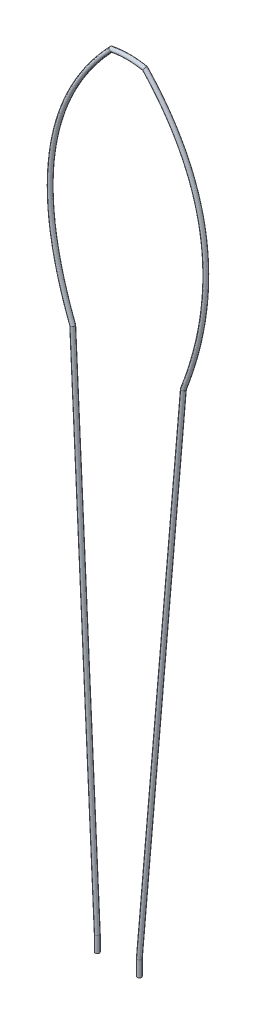
ISO-10303-21;
HEADER;
FILE_DESCRIPTION(('STEP AP214'),'2;1');
FILE_NAME('part.step','',(''),(''),'','','');
FILE_SCHEMA(('AUTOMOTIVE_DESIGN { 1 0 10303 214 1 1 1 1 }'));
ENDSEC;
DATA;
#1=APPLICATION_CONTEXT('core data for automotive mechanical design processes');
#2=APPLICATION_PROTOCOL_DEFINITION('international standard','automotive_design',2000,#1);
#3=PRODUCT_CONTEXT('',#1,'mechanical');
#4=PRODUCT('Part','Part','',(#3));
#5=PRODUCT_RELATED_PRODUCT_CATEGORY('part','',(#4));
#6=PRODUCT_DEFINITION_FORMATION('','',#4);
#7=PRODUCT_DEFINITION_CONTEXT('part definition',#1,'design');
#8=PRODUCT_DEFINITION('design','',#6,#7);
#9=PRODUCT_DEFINITION_SHAPE('','',#8);
#10=(LENGTH_UNIT() NAMED_UNIT(*) SI_UNIT(.MILLI.,.METRE.));
#11=(NAMED_UNIT(*) PLANE_ANGLE_UNIT() SI_UNIT($,.RADIAN.));
#12=(NAMED_UNIT(*) SI_UNIT($,.STERADIAN.) SOLID_ANGLE_UNIT());
#13=UNCERTAINTY_MEASURE_WITH_UNIT(LENGTH_MEASURE(1.E-05),#10,'distance_accuracy_value','');
#14=(GEOMETRIC_REPRESENTATION_CONTEXT(3) GLOBAL_UNCERTAINTY_ASSIGNED_CONTEXT((#13)) GLOBAL_UNIT_ASSIGNED_CONTEXT((#10,
#11,#12)) REPRESENTATION_CONTEXT('',''));
#15=CARTESIAN_POINT('',(0.,0.,0.));
#16=DIRECTION('',(0.,0.,1.));
#17=DIRECTION('',(1.,0.,0.));
#18=AXIS2_PLACEMENT_3D('',#15,#16,#17);
#19=CARTESIAN_POINT('',(98.4304091748136,-88.8841982504118,0.));
#20=DIRECTION('',(0.,1.,0.));
#21=DIRECTION('',(0.,0.,1.));
#22=AXIS2_PLACEMENT_3D('',#19,#20,#21);
#23=PLANE('',#22);
#24=CARTESIAN_POINT('',(98.4304091748136,-88.8841982504118,0.));
#25=DIRECTION('',(0.,1.,0.));
#26=DIRECTION('',(0.,0.,1.));
#27=AXIS2_PLACEMENT_3D('',#24,#25,#26);
#28=CIRCLE('',#27,0.25);
#29=CARTESIAN_POINT('',(98.4304091748136,-88.8841982504118,0.25));
#30=VERTEX_POINT('',#29);
#31=EDGE_CURVE('E48',#30,#30,#28,.T.);
#32=ORIENTED_EDGE('',*,*,#31,.F.);
#33=EDGE_LOOP('',(#32));
#34=FACE_BOUND('',#33,.T.);
#35=ADVANCED_FACE('F45',(#34),#23,.F.);
#36=CARTESIAN_POINT('',(93.4304091748136,-88.8841982504118,0.));
#37=DIRECTION('',(0.,-1.,0.));
#38=DIRECTION('',(0.,0.,1.));
#39=AXIS2_PLACEMENT_3D('',#36,#37,#38);
#40=PLANE('',#39);
#41=CARTESIAN_POINT('',(93.4304091748136,-88.8841982504118,0.));
#42=DIRECTION('',(0.,-1.,0.));
#43=DIRECTION('',(0.,0.,1.));
#44=AXIS2_PLACEMENT_3D('',#41,#42,#43);
#45=CIRCLE('',#44,0.25);
#46=CARTESIAN_POINT('',(93.4304091748136,-88.8841982504118,0.25));
#47=VERTEX_POINT('',#46);
#48=EDGE_CURVE('E54',#47,#47,#45,.T.);
#49=ORIENTED_EDGE('',*,*,#48,.T.);
#50=EDGE_LOOP('',(#49));
#51=FACE_BOUND('',#50,.T.);
#52=ADVANCED_FACE('F208',(#51),#40,.T.);
#53=CARTESIAN_POINT('',(98.4304091748136,-86.8251914155239,0.));
#54=DIRECTION('',(0.,-1.,0.));
#55=DIRECTION('',(0.,0.,-1.));
#56=AXIS2_PLACEMENT_3D('',#53,#54,#55);
#57=CYLINDRICAL_SURFACE('',#56,0.25);
#58=CARTESIAN_POINT('',(98.4304091748136,-87.0251914155239,0.));
#59=DIRECTION('',(-0.0426283769381555,-0.999090997597125,0.));
#60=DIRECTION('',(-0.999090997597125,0.0426283769381555,0.));
#61=AXIS2_PLACEMENT_3D('',#58,#59,#60);
#62=ELLIPSE('',#61,0.250227457360006,0.25);
#63=CARTESIAN_POINT('',(98.1804091748136,-87.0145246251513,0.));
#64=VERTEX_POINT('',#63);
#65=EDGE_CURVE('E92',#64,#64,#62,.T.);
#66=ORIENTED_EDGE('',*,*,#65,.T.);
#67=EDGE_LOOP('',(#66));
#68=FACE_BOUND('',#67,.T.);
#69=ORIENTED_EDGE('',*,*,#31,.T.);
#70=EDGE_LOOP('',(#69));
#71=FACE_BOUND('',#70,.T.);
#72=ADVANCED_FACE('F252',(#68,#71),#57,.T.);
#73=CARTESIAN_POINT('',(103.67756776521,-25.6477054852913,0.));
#74=DIRECTION('',(-0.0851792552821761,-0.996365642959237,0.));
#75=DIRECTION('',(0.996365642959237,-0.0851792552821761,0.));
#76=AXIS2_PLACEMENT_3D('',#73,#74,#75);
#77=CYLINDRICAL_SURFACE('',#76,0.25);
#78=CARTESIAN_POINT('',(103.660531914154,-25.8469786138831,0.25));
#79=CARTESIAN_POINT('',(103.662480363556,-25.8474267718731,0.250000123586937));
#80=CARTESIAN_POINT('',(103.664429321976,-25.8478750382362,0.249976583606907));
#81=CARTESIAN_POINT('',(103.680278610003,-25.851520352543,0.249593129721214));
#82=CARTESIAN_POINT('',(103.694173607914,-25.8547157440667,0.248055677651921));
#83=CARTESIAN_POINT('',(103.721540521826,-25.8610083941347,0.242610381009296));
#84=CARTESIAN_POINT('',(103.735011270705,-25.8641053821461,0.23869651192906));
#85=CARTESIAN_POINT('',(103.761099589944,-25.8701024570513,0.228607630079545));
#86=CARTESIAN_POINT('',(103.773718623095,-25.873002881573,0.222436617305926));
#87=CARTESIAN_POINT('',(103.79777909136,-25.8785324375997,0.207989104864477));
#88=CARTESIAN_POINT('',(103.809218822299,-25.8811611765138,0.199709616597292));
#89=CARTESIAN_POINT('',(103.830497291402,-25.8860502799559,0.181336772697421));
#90=CARTESIAN_POINT('',(103.840345593013,-25.888312845084,0.171255082555696));
#91=CARTESIAN_POINT('',(103.858247551056,-25.8924253410986,0.149509674363791));
#92=CARTESIAN_POINT('',(103.866298756181,-25.8942747083715,0.137843829913053));
#93=CARTESIAN_POINT('',(103.880268149256,-25.8974832955838,0.113408559110432));
#94=CARTESIAN_POINT('',(103.886208661594,-25.8988476455446,0.100652569374198));
#95=CARTESIAN_POINT('',(103.895906567582,-25.9010748678043,0.0742752330349935));
#96=CARTESIAN_POINT('',(103.899661011278,-25.9019370624784,0.060652744502096));
#97=CARTESIAN_POINT('',(103.90483058059,-25.9031242192557,0.0330854901804843));
#98=CARTESIAN_POINT('',(103.906268558602,-25.903454429494,0.0191452660624145));
#99=CARTESIAN_POINT('',(103.906843927449,-25.9035865536514,-0.00879032355101798));
#100=CARTESIAN_POINT('',(103.90597817049,-25.9033877447254,-0.022785738376211));
#101=CARTESIAN_POINT('',(103.89993524307,-25.9020000523981,-0.0641007248306422));
#102=CARTESIAN_POINT('',(103.891353940902,-25.9000294393461,-0.0909802576589777));
#103=CARTESIAN_POINT('',(103.866025512096,-25.8942120217755,-0.140341877686288));
#104=CARTESIAN_POINT('',(103.849257037696,-25.8903603123576,-0.162812252243708));
#105=CARTESIAN_POINT('',(103.809152936895,-25.8811462570447,-0.201247299064957));
#106=CARTESIAN_POINT('',(103.78570575623,-25.875758248665,-0.217089084722126));
#107=CARTESIAN_POINT('',(103.734953143866,-25.8640923659907,-0.239945646150534));
#108=CARTESIAN_POINT('',(103.707648453836,-25.8578146627537,-0.246962116171133));
#109=CARTESIAN_POINT('',(103.675569702729,-25.8504372643947,-0.249577697139247));
#110=CARTESIAN_POINT('',(103.670975808722,-25.8493807218337,-0.249818795968514));
#111=CARTESIAN_POINT('',(103.664430055989,-25.8478752069333,-0.249976313097081));
#112=CARTESIAN_POINT('',(103.662481266806,-25.8474269793814,-0.249999769623248));
#113=CARTESIAN_POINT('',(103.660531914154,-25.846978613883,-0.25));
#114=B_SPLINE_CURVE_WITH_KNOTS('',3,(#78,#79,#80,#81,#82,#83,#84,#85,#86,#87,#88,#89,#90,#91,
#92,#93,#94,#95,#96,#97,#98,#99,#100,#101,#102,#103,#104,#105,#106,#107,#108,#109,#110,#111,
#112,#113),.UNSPECIFIED.,.F.,.F.,(4,2,2,2,2,2,2,2,2,2,2,2,2,2,2,2,2,4),(0.,0.00599931926925032,
0.0487902429804174,0.0916901024856514,0.134514302489898,0.177399543624487,0.220016631168717,
0.26269149948709,0.30490053445358,0.347166396485674,0.38901268589639,0.430916182898124,
0.514052322266972,0.597406403293345,0.682243794380924,0.767064896233011,0.781223529930374,
0.787222849200372),.UNSPECIFIED.);
#115=CARTESIAN_POINT('',(103.660531914154,-25.846978613883,-0.25));
#116=VERTEX_POINT('',#115);
#117=CARTESIAN_POINT('',(103.660531914154,-25.8469786138831,0.25));
#118=VERTEX_POINT('',#117);
#119=EDGE_CURVE('E82',#116,#118,#114,.F.);
#120=ORIENTED_EDGE('',*,*,#119,.T.);
#121=CARTESIAN_POINT('',(103.660531914154,-25.8469786138831,0.25));
#122=CARTESIAN_POINT('',(103.658583464699,-25.8465304560091,0.250000123584482));
#123=CARTESIAN_POINT('',(103.656634508171,-25.8460821814606,0.249976583605752));
#124=CARTESIAN_POINT('',(103.640784781129,-25.8424366255877,0.249593119043322));
#125=CARTESIAN_POINT('',(103.626889437467,-25.839240590329,0.248055579265373));
#126=CARTESIAN_POINT('',(103.599522035961,-25.8329458747837,0.242610014113936));
#127=CARTESIAN_POINT('',(103.586051145901,-25.829847463086,0.238695963324922));
#128=CARTESIAN_POINT('',(103.559962732486,-25.8238469173933,0.228606675734152));
#129=CARTESIAN_POINT('',(103.547343745013,-25.8209444466458,0.222435441805673));
#130=CARTESIAN_POINT('',(103.523283478863,-25.8154103851236,0.207987455629567));
#131=CARTESIAN_POINT('',(103.511843904679,-25.8127791863926,0.199707714458069));
#132=CARTESIAN_POINT('',(103.490565641547,-25.8078850040681,0.181334176031878));
#133=CARTESIAN_POINT('',(103.480717412536,-25.8056198261918,0.171252015580514));
#134=CARTESIAN_POINT('',(103.46281569569,-25.8015022751279,0.149505551006106));
#135=CARTESIAN_POINT('',(103.454764659121,-25.7996504657512,0.137839120470464));
#136=CARTESIAN_POINT('',(103.440795869758,-25.7964375203343,0.113402853534564));
#137=CARTESIAN_POINT('',(103.434855745276,-25.7950712386169,0.100646482689712));
#138=CARTESIAN_POINT('',(103.425158648974,-25.7928408194917,0.0742683463074073));
#139=CARTESIAN_POINT('',(103.421404626528,-25.7919773604661,0.0606454390260176));
#140=CARTESIAN_POINT('',(103.416236066848,-25.7907885450577,0.0330780118590248));
#141=CARTESIAN_POINT('',(103.414798569443,-25.790457907629,0.0191380548485107));
#142=CARTESIAN_POINT('',(103.414223992187,-25.7903257496519,-0.00879693714279142));
#143=CARTESIAN_POINT('',(103.415090059424,-25.7905249529625,-0.0227920213637436));
#144=CARTESIAN_POINT('',(103.421133525194,-25.791915004767,-0.0641051759567712));
#145=CARTESIAN_POINT('',(103.429714538737,-25.793888715477,-0.0909831140823638));
#146=CARTESIAN_POINT('',(103.455041316685,-25.799714099739,-0.140342176279831));
#147=CARTESIAN_POINT('',(103.471808582624,-25.8035707188286,-0.162811501857238));
#148=CARTESIAN_POINT('',(103.511911137578,-25.8127946514152,-0.201246554996148));
#149=CARTESIAN_POINT('',(103.535358460274,-25.8181877334892,-0.217088866534333));
#150=CARTESIAN_POINT('',(103.58611201909,-25.8298614660552,-0.239946072621147));
#151=CARTESIAN_POINT('',(103.613417514744,-25.8361419462366,-0.24696265846088));
#152=CARTESIAN_POINT('',(103.645496314163,-25.8435203131417,-0.249577810933675));
#153=CARTESIAN_POINT('',(103.650089112453,-25.8445766912857,-0.249818822154134));
#154=CARTESIAN_POINT('',(103.656633774214,-25.8460820125372,-0.249976313116991));
#155=CARTESIAN_POINT('',(103.6585825615,-25.8465302481958,-0.249999769635366));
#156=CARTESIAN_POINT('',(103.660531914154,-25.846978613883,-0.25));
#157=B_SPLINE_CURVE_WITH_KNOTS('',3,(#121,#122,#123,#124,#125,#126,#127,#128,#129,#130,#131,
#132,#133,#134,#135,#136,#137,#138,#139,#140,#141,#142,#143,#144,#145,#146,#147,#148,#149,#150,
#151,#152,#153,#154,#155,#156),.UNSPECIFIED.,.F.,.F.,(4,2,2,2,2,2,2,2,2,2,2,2,2,2,2,2,2,4),(0.,
0.00599931926820248,0.0487916893638889,0.091693011110716,0.134518617930567,0.177405273632655,
0.220024435148263,0.262701376301339,0.304911494074556,0.347178428372996,0.389023799751851,
0.430926368878063,0.514058491339466,0.597410148118723,0.682251543605025,0.767076678290314,
0.781231990937181,0.787231310206237),.UNSPECIFIED.);
#158=EDGE_CURVE('E84',#116,#118,#157,.F.);
#159=ORIENTED_EDGE('',*,*,#158,.F.);
#160=EDGE_LOOP('',(#120,#159));
#161=FACE_BOUND('',#160,.T.);
#162=ORIENTED_EDGE('',*,*,#65,.F.);
#163=EDGE_LOOP('',(#162));
#164=FACE_BOUND('',#163,.T.);
#165=ADVANCED_FACE('F90',(#161,#164),#77,.T.);
#166=CARTESIAN_POINT('',(98.9161816177439,5.05492095703359,0.25));
#167=CARTESIAN_POINT('',(98.9792153162674,4.98767452720953,0.25));
#168=CARTESIAN_POINT('',(99.0422497615282,4.92042833591178,0.25));
#169=CARTESIAN_POINT('',(101.038234359238,2.7910133161343,0.25));
#170=CARTESIAN_POINT('',(102.582889192364,0.60481318059812,0.25));
#171=CARTESIAN_POINT('',(104.895467837564,-4.01569454638179,0.25));
#172=CARTESIAN_POINT('',(105.663414548912,-6.44999482319255,0.25));
#173=CARTESIAN_POINT('',(106.422622749062,-11.566688203374,0.25));
#174=CARTESIAN_POINT('',(106.413884237859,-14.2490813068383,0.25));
#175=CARTESIAN_POINT('',(105.619721992908,-19.8619603403891,0.25));
#176=CARTESIAN_POINT('',(104.83427847987,-22.7924525885129,0.25));
#177=CARTESIAN_POINT('',(103.636619081858,-25.9092087159521,0.25));
#178=CARTESIAN_POINT('',(103.612705443631,-25.9714390754572,0.25));
#179=CARTESIAN_POINT('',(103.588792208371,-26.033669306244,0.25));
#180=CARTESIAN_POINT('',(99.2809768244092,5.3968631410267,0.25));
#181=CARTESIAN_POINT('',(99.3440105229327,5.32961671120264,0.25));
#182=CARTESIAN_POINT('',(99.4065608229139,5.26288703796779,0.25));
#183=CARTESIAN_POINT('',(101.417876235599,3.1171160953157,0.25));
#184=CARTESIAN_POINT('',(103.006751991853,0.875074712842028,0.25));
#185=CARTESIAN_POINT('',(105.365852182536,-3.83838257111502,0.25));
#186=CARTESIAN_POINT('',(106.150388943162,-6.32531587117774,0.25));
#187=CARTESIAN_POINT('',(106.924818734805,-11.5445953619634,0.25));
#188=CARTESIAN_POINT('',(106.915002068591,-14.2763778846631,0.25));
#189=CARTESIAN_POINT('',(106.108742377533,-19.9747577113588,0.25));
#190=CARTESIAN_POINT('',(105.306814931382,-22.9566825711238,0.25));
#191=CARTESIAN_POINT('',(104.103227450859,-26.0888660067428,0.25));
#192=CARTESIAN_POINT('',(104.079432174535,-26.1507883399143,0.25));
#193=CARTESIAN_POINT('',(104.055518939273,-26.2130185707011,0.25));
#194=CARTESIAN_POINT('',(99.2809768244092,5.3968631410267,-0.25));
#195=CARTESIAN_POINT('',(99.3440105229327,5.32961671120264,-0.25));
#196=CARTESIAN_POINT('',(99.4065608229139,5.26288703796779,-0.25));
#197=CARTESIAN_POINT('',(101.417876235599,3.1171160953157,-0.25));
#198=CARTESIAN_POINT('',(103.006751991853,0.875074712842028,-0.25));
#199=CARTESIAN_POINT('',(105.365852182536,-3.83838257111502,-0.25));
#200=CARTESIAN_POINT('',(106.150388943162,-6.32531587117774,-0.25));
#201=CARTESIAN_POINT('',(106.924818734805,-11.5445953619634,-0.25));
#202=CARTESIAN_POINT('',(106.915002068591,-14.2763778846631,-0.25));
#203=CARTESIAN_POINT('',(106.108742377533,-19.9747577113588,-0.25));
#204=CARTESIAN_POINT('',(105.306814931382,-22.9566825711238,-0.25));
#205=CARTESIAN_POINT('',(104.103227450859,-26.0888660067428,-0.25));
#206=CARTESIAN_POINT('',(104.079432174535,-26.1507883399143,-0.25));
#207=CARTESIAN_POINT('',(104.055518939273,-26.2130185707011,-0.25));
#208=CARTESIAN_POINT('',(98.9161816177439,5.05492095703359,-0.25));
#209=CARTESIAN_POINT('',(98.9792153162674,4.98767452720953,-0.25));
#210=CARTESIAN_POINT('',(99.0422497615282,4.92042833591178,-0.25));
#211=CARTESIAN_POINT('',(101.038234359238,2.7910133161343,-0.25));
#212=CARTESIAN_POINT('',(102.582889192364,0.60481318059812,-0.25));
#213=CARTESIAN_POINT('',(104.895467837564,-4.01569454638179,-0.25));
#214=CARTESIAN_POINT('',(105.663414548912,-6.44999482319255,-0.25));
#215=CARTESIAN_POINT('',(106.422622749062,-11.566688203374,-0.25));
#216=CARTESIAN_POINT('',(106.413884237859,-14.2490813068383,-0.25));
#217=CARTESIAN_POINT('',(105.619721992908,-19.8619603403891,-0.25));
#218=CARTESIAN_POINT('',(104.83427847987,-22.7924525885129,-0.25));
#219=CARTESIAN_POINT('',(103.636619081858,-25.9092087159521,-0.25));
#220=CARTESIAN_POINT('',(103.612705443631,-25.9714390754572,-0.25));
#221=CARTESIAN_POINT('',(103.588792208371,-26.033669306244,-0.25));
#222=CARTESIAN_POINT('',(98.5513864110785,4.71297877304049,-0.25));
#223=CARTESIAN_POINT('',(98.614420109602,4.64573234321643,-0.25));
#224=CARTESIAN_POINT('',(98.6779387001425,4.57796963385579,-0.25));
#225=CARTESIAN_POINT('',(100.658592482877,2.46491053695292,-0.25));
#226=CARTESIAN_POINT('',(102.159026392876,0.334551648354212,-0.25));
#227=CARTESIAN_POINT('',(104.425083492593,-4.19300652164856,-0.25));
#228=CARTESIAN_POINT('',(105.176440154662,-6.57467377520734,-0.25));
#229=CARTESIAN_POINT('',(105.920426763319,-11.5887810447846,-0.25));
#230=CARTESIAN_POINT('',(105.912766407126,-14.2217847290135,-0.25));
#231=CARTESIAN_POINT('',(105.130701608283,-19.7491629694194,-0.25));
#232=CARTESIAN_POINT('',(104.361742028359,-22.628222605902,-0.25));
#233=CARTESIAN_POINT('',(103.170010712857,-25.7295514251614,-0.25));
#234=CARTESIAN_POINT('',(103.145978712728,-25.792089811,-0.25));
#235=CARTESIAN_POINT('',(103.122065477469,-25.8543200417869,-0.25));
#236=CARTESIAN_POINT('',(98.5513864110785,4.71297877304049,0.25));
#237=CARTESIAN_POINT('',(98.614420109602,4.64573234321643,0.25));
#238=CARTESIAN_POINT('',(98.6779387001425,4.57796963385579,0.25));
#239=CARTESIAN_POINT('',(100.658592482877,2.46491053695292,0.25));
#240=CARTESIAN_POINT('',(102.159026392876,0.334551648354212,0.25));
#241=CARTESIAN_POINT('',(104.425083492593,-4.19300652164856,0.25));
#242=CARTESIAN_POINT('',(105.176440154662,-6.57467377520734,0.25));
#243=CARTESIAN_POINT('',(105.920426763319,-11.5887810447846,0.25));
#244=CARTESIAN_POINT('',(105.912766407126,-14.2217847290135,0.25));
#245=CARTESIAN_POINT('',(105.130701608283,-19.7491629694194,0.25));
#246=CARTESIAN_POINT('',(104.361742028359,-22.628222605902,0.25));
#247=CARTESIAN_POINT('',(103.170010712857,-25.7295514251614,0.25));
#248=CARTESIAN_POINT('',(103.145978712728,-25.792089811,0.25));
#249=CARTESIAN_POINT('',(103.122065477469,-25.8543200417869,0.25));
#250=CARTESIAN_POINT('',(98.9161816177439,5.05492095703359,0.25));
#251=CARTESIAN_POINT('',(98.9792153162674,4.98767452720953,0.25));
#252=CARTESIAN_POINT('',(99.0422497615282,4.92042833591178,0.25));
#253=CARTESIAN_POINT('',(101.038234359238,2.7910133161343,0.25));
#254=CARTESIAN_POINT('',(102.582889192364,0.60481318059812,0.25));
#255=CARTESIAN_POINT('',(104.895467837564,-4.01569454638179,0.25));
#256=CARTESIAN_POINT('',(105.663414548912,-6.44999482319255,0.25));
#257=CARTESIAN_POINT('',(106.422622749062,-11.566688203374,0.25));
#258=CARTESIAN_POINT('',(106.413884237859,-14.2490813068383,0.25));
#259=CARTESIAN_POINT('',(105.619721992908,-19.8619603403891,0.25));
#260=CARTESIAN_POINT('',(104.83427847987,-22.7924525885129,0.25));
#261=CARTESIAN_POINT('',(103.636619081858,-25.9092087159521,0.25));
#262=CARTESIAN_POINT('',(103.612705443631,-25.9714390754572,0.25));
#263=CARTESIAN_POINT('',(103.588792208371,-26.033669306244,0.25));
#264=(BOUNDED_SURFACE() B_SPLINE_SURFACE(3,3,((#166,#167,#168,#169,#170,#171,#172,#173,#174,
#175,#176,#177,#178,#179),(#180,#181,#182,#183,#184,#185,#186,#187,#188,#189,#190,#191,#192,
#193),(#194,#195,#196,#197,#198,#199,#200,#201,#202,#203,#204,#205,#206,#207),(#208,#209,#210,
#211,#212,#213,#214,#215,#216,#217,#218,#219,#220,#221),(#222,#223,#224,#225,#226,#227,#228,
#229,#230,#231,#232,#233,#234,#235),(#236,#237,#238,#239,#240,#241,#242,#243,#244,#245,#246,
#247,#248,#249),(#250,#251,#252,#253,#254,#255,#256,#257,#258,#259,#260,#261,#262,#263)),
.UNSPECIFIED.,.T.,.F.,.F.) B_SPLINE_SURFACE_WITH_KNOTS((4,3,4),(4,2,2,2,2,2,4),(0.,0.5,1.),
(-0.00815242221913773,0.,0.25,0.5,0.75,1.,1.0050932699175),
.UNSPECIFIED.) GEOMETRIC_REPRESENTATION_ITEM() RATIONAL_B_SPLINE_SURFACE(((1.,1.,1.,1.,1.,1.,1.,
1.,1.,1.,1.,1.,1.,1.),(0.333333333333333,0.333333333333333,0.333333333333333,0.333333333333333,
0.333333333333333,0.333333333333333,0.333333333333333,0.333333333333333,0.333333333333333,
0.333333333333333,0.333333333333333,0.333333333333333,0.333333333333333,0.333333333333333),
(0.333333333333333,0.333333333333333,0.333333333333333,0.333333333333333,0.333333333333333,
0.333333333333333,0.333333333333333,0.333333333333333,0.333333333333333,0.333333333333333,
0.333333333333333,0.333333333333333,0.333333333333333,0.333333333333333),(1.,1.,1.,1.,1.,1.,1.,
1.,1.,1.,1.,1.,1.,1.),(0.333333333333333,0.333333333333333,0.333333333333333,0.333333333333333,
0.333333333333333,0.333333333333333,0.333333333333333,0.333333333333333,0.333333333333333,
0.333333333333333,0.333333333333333,0.333333333333333,0.333333333333333,0.333333333333333),
(0.333333333333333,0.333333333333333,0.333333333333333,0.333333333333333,0.333333333333333,
0.333333333333333,0.333333333333333,0.333333333333333,0.333333333333333,0.333333333333333,
0.333333333333333,0.333333333333333,0.333333333333333,0.333333333333333),(1.,1.,1.,1.,1.,1.,1.,
1.,1.,1.,1.,1.,1.,1.))) REPRESENTATION_ITEM('') SURFACE());
#265=CARTESIAN_POINT('',(99.1052827133152,4.85318166756071,0.25));
#266=CARTESIAN_POINT('',(99.1046117855717,4.85197420524635,0.250000166996254));
#267=CARTESIAN_POINT('',(99.1039406437859,4.85076629776251,0.249989774008769));
#268=CARTESIAN_POINT('',(99.0884336262863,4.82285571175678,0.249506194687581));
#269=CARTESIAN_POINT('',(99.0735369885194,4.79601481099525,0.243895103208886));
#270=CARTESIAN_POINT('',(99.0455405268912,4.74552470186785,0.222795556193966));
#271=CARTESIAN_POINT('',(99.0324421871773,4.72187813005844,0.207299000963824));
#272=CARTESIAN_POINT('',(99.0099415047663,4.68123131254695,0.168328916086506));
#273=CARTESIAN_POINT('',(99.0004526993681,4.66407564658963,0.145070998423289));
#274=CARTESIAN_POINT('',(98.9864661740594,4.6387801526763,0.0943224234495454));
#275=CARTESIAN_POINT('',(98.9817473807583,4.630241016589,0.0670938798656342));
#276=CARTESIAN_POINT('',(98.9773323117969,4.62225156030048,0.0121580174386671));
#277=CARTESIAN_POINT('',(98.9774268215395,4.62242264242773,-0.0154771586382311));
#278=CARTESIAN_POINT('',(98.9820592531194,4.6308053174723,-0.0685913615841311));
#279=CARTESIAN_POINT('',(98.986521054737,4.63887916815079,-0.0940992078084248));
#280=CARTESIAN_POINT('',(98.9992616982939,4.6619218651549,-0.141150125351543));
#281=CARTESIAN_POINT('',(99.0075996886246,4.67699755195914,-0.162624246442205));
#282=CARTESIAN_POINT('',(99.0274690392699,4.7128966504846,-0.199878459818684));
#283=CARTESIAN_POINT('',(99.0391161555499,4.73392829850296,-0.215392423156693));
#284=CARTESIAN_POINT('',(99.0653042901448,4.78117355818684,-0.239199556823132));
#285=CARTESIAN_POINT('',(99.0800079776641,4.80767715570066,-0.246757710896387));
#286=CARTESIAN_POINT('',(99.0976309063085,4.839408639433,-0.249612309681107));
#287=CARTESIAN_POINT('',(99.1004488855134,4.84448160792358,-0.249881833459432));
#288=CARTESIAN_POINT('',(99.1039403528914,4.85076577074987,-0.249989539331004));
#289=CARTESIAN_POINT('',(99.10461147063,4.85197363456738,-0.249999908621299));
#290=CARTESIAN_POINT('',(99.105282713316,4.85318166756216,-0.25));
#291=B_SPLINE_CURVE_WITH_KNOTS('',3,(#265,#266,#267,#268,#269,#270,#271,#272,#273,#274,#275,
#276,#277,#278,#279,#280,#281,#282,#283,#284,#285,#286,#287,#288,#289,#290),.UNSPECIFIED.,.F.,
.F.,(4,2,2,2,2,2,2,2,2,2,2,2,4),(0.,0.00414544156242605,0.095764410967136,0.187458545326586,
0.276792290246449,0.361764231091698,0.443046078586284,0.522935991423188,0.604087143435555,
0.688528168415999,0.780225030902473,0.797650679644662,0.801796121207646),.UNSPECIFIED.);
#292=CARTESIAN_POINT('',(99.1052827133152,4.85318166756071,0.25));
#293=VERTEX_POINT('',#292);
#294=CARTESIAN_POINT('',(99.105282713316,4.85318166756216,-0.25));
#295=VERTEX_POINT('',#294);
#296=EDGE_CURVE('E88',#293,#295,#291,.T.);
#297=CARTESIAN_POINT('',(99.1052827133152,4.85318166756071,0.25));
#298=CARTESIAN_POINT('',(99.1059536390581,4.85438912904943,0.250000167418272));
#299=CARTESIAN_POINT('',(99.1066248052804,4.85559702311786,0.249989774389964));
#300=CARTESIAN_POINT('',(99.1221176270439,4.88347936238336,0.249506646909495));
#301=CARTESIAN_POINT('',(99.1370125256012,4.91028552222043,0.243906109965237));
#302=CARTESIAN_POINT('',(99.1650256977128,4.96070033097216,0.222831841676252));
#303=CARTESIAN_POINT('',(99.1781424531597,4.98430624764816,0.207349737409897));
#304=CARTESIAN_POINT('',(99.2006776578275,5.02486225486489,0.168424552414992));
#305=CARTESIAN_POINT('',(99.2101841322377,5.04197076414208,0.145201065652104));
#306=CARTESIAN_POINT('',(99.224213117433,5.06721827703422,0.0945162100751939));
#307=CARTESIAN_POINT('',(99.2289530734806,5.075748611143,0.0673119538701918));
#308=CARTESIAN_POINT('',(99.2334078320868,5.08376568546169,0.0123800360168506));
#309=CARTESIAN_POINT('',(99.2333251260881,5.08361684247562,-0.0152777778944479));
#310=CARTESIAN_POINT('',(99.2286928182517,5.07528023870763,-0.0684647646910263));
#311=CARTESIAN_POINT('',(99.2242168103873,5.06722492245161,-0.0940214942910337));
#312=CARTESIAN_POINT('',(99.2114318992194,5.04421633081159,-0.141145503180419));
#313=CARTESIAN_POINT('',(99.2030663090431,5.02916103757476,-0.162646932474964));
#314=CARTESIAN_POINT('',(99.1826423801576,4.99240465322141,-0.200837085905454));
#315=CARTESIAN_POINT('',(99.1703211370543,4.97023041471818,-0.216925149773408));
#316=CARTESIAN_POINT('',(99.1437932971165,4.92248877140606,-0.240014132101773));
#317=CARTESIAN_POINT('',(99.1295869560085,4.89692182684116,-0.247016281742906));
#318=CARTESIAN_POINT('',(99.1126312264473,4.86640674056392,-0.249640594599546));
#319=CARTESIAN_POINT('',(99.1099645725759,4.86160758251535,-0.249886476749935));
#320=CARTESIAN_POINT('',(99.1066250931728,4.85559754122591,-0.24998955178603));
#321=CARTESIAN_POINT('',(99.1059539506634,4.85438968983241,-0.249999923225253));
#322=CARTESIAN_POINT('',(99.105282713316,4.85318166756216,-0.25));
#323=B_SPLINE_CURVE_WITH_KNOTS('',3,(#297,#298,#299,#300,#301,#302,#303,#304,#305,#306,#307,
#308,#309,#310,#311,#312,#313,#314,#315,#316,#317,#318,#319,#320,#321,#322),.UNSPECIFIED.,.F.,
.F.,(4,2,2,2,2,2,2,2,2,2,2,2,4),(0.,0.00414544156755075,0.0956695682301381,0.187271348922904,
0.276469102850391,0.361382780822384,0.442733822803632,0.522744981017995,0.603960645185648,
0.692423449337611,0.780874265144313,0.797359256612421,0.801504698180338),.UNSPECIFIED.);
#324=EDGE_CURVE('E139',#293,#295,#323,.T.);
#325=ORIENTED_EDGE('',*,*,#158,.T.);
#326=ORIENTED_EDGE('',*,*,#119,.F.);
#327=EDGE_LOOP('',(#325,#326));
#328=FACE_BOUND('',#327,.T.);
#329=ORIENTED_EDGE('',*,*,#296,.T.);
#330=ORIENTED_EDGE('',*,*,#324,.F.);
#331=EDGE_LOOP('',(#329,#330));
#332=FACE_BOUND('',#331,.T.);
#333=ADVANCED_FACE('F85',(#328,#332),#264,.F.);
#334=CARTESIAN_POINT('',(94.8355657464165,4.79948190711105,0.25));
#335=CARTESIAN_POINT('',(94.9254714020506,4.81738182726233,0.25));
#336=CARTESIAN_POINT('',(95.0153770607654,4.83528394121678,0.25));
#337=CARTESIAN_POINT('',(96.4389889732644,5.11868565965408,0.25));
#338=CARTESIAN_POINT('',(97.7723223066084,5.11868564212139,0.25));
#339=CARTESIAN_POINT('',(99.1956766860263,4.83517666237799,0.25));
#340=CARTESIAN_POINT('',(99.2860706525345,4.81716724090562,0.25));
#341=CARTESIAN_POINT('',(99.3764646221456,4.79916002757831,0.25));
#342=CARTESIAN_POINT('',(94.7379336309104,5.2898572429731,0.25));
#343=CARTESIAN_POINT('',(94.8278392865446,5.30775716312437,0.25));
#344=CARTESIAN_POINT('',(94.915635315493,5.32523935966246,0.25));
#345=CARTESIAN_POINT('',(96.3726521806418,5.61529026443293,0.25));
#346=CARTESIAN_POINT('',(97.8386786269236,5.61528984245045,0.25));
#347=CARTESIAN_POINT('',(99.2954858675754,5.32511841574558,0.25));
#348=CARTESIAN_POINT('',(99.3837553195782,5.30753211100193,0.25));
#349=CARTESIAN_POINT('',(99.4741492891893,5.28952489767462,0.25));
#350=CARTESIAN_POINT('',(94.7379336309104,5.2898572429731,-0.25));
#351=CARTESIAN_POINT('',(94.8278392865446,5.30775716312437,-0.25));
#352=CARTESIAN_POINT('',(94.915635315493,5.32523935966246,-0.25));
#353=CARTESIAN_POINT('',(96.3726521806418,5.61529026443293,-0.25));
#354=CARTESIAN_POINT('',(97.8386786269236,5.61528984245045,-0.25));
#355=CARTESIAN_POINT('',(99.2954858675754,5.32511841574558,-0.25));
#356=CARTESIAN_POINT('',(99.3837553195782,5.30753211100193,-0.25));
#357=CARTESIAN_POINT('',(99.4741492891893,5.28952489767462,-0.25));
#358=CARTESIAN_POINT('',(94.8355657464165,4.79948190711105,-0.25));
#359=CARTESIAN_POINT('',(94.9254714020506,4.81738182726233,-0.25));
#360=CARTESIAN_POINT('',(95.0153770607654,4.83528394121678,-0.25));
#361=CARTESIAN_POINT('',(96.4389889732644,5.11868565965408,-0.25));
#362=CARTESIAN_POINT('',(97.7723223066084,5.11868564212139,-0.25));
#363=CARTESIAN_POINT('',(99.1956766860263,4.83517666237799,-0.25));
#364=CARTESIAN_POINT('',(99.2860706525345,4.81716724090562,-0.25));
#365=CARTESIAN_POINT('',(99.3764646221456,4.79916002757831,-0.25));
#366=CARTESIAN_POINT('',(94.9331978619225,4.30910657124901,-0.25));
#367=CARTESIAN_POINT('',(95.0231035175567,4.32700649140029,-0.25));
#368=CARTESIAN_POINT('',(95.1151188060379,4.34532852277112,-0.25));
#369=CARTESIAN_POINT('',(96.5053257658871,4.62208105487524,-0.25));
#370=CARTESIAN_POINT('',(97.7059659862933,4.62208144179232,-0.25));
#371=CARTESIAN_POINT('',(99.0958675044771,4.34523490901039,-0.25));
#372=CARTESIAN_POINT('',(99.1883859854909,4.3268023708093,-0.25));
#373=CARTESIAN_POINT('',(99.278779955102,4.30879515748199,-0.25));
#374=CARTESIAN_POINT('',(94.9331978619225,4.30910657124901,0.25));
#375=CARTESIAN_POINT('',(95.0231035175567,4.32700649140029,0.25));
#376=CARTESIAN_POINT('',(95.1151188060379,4.34532852277112,0.25));
#377=CARTESIAN_POINT('',(96.5053257658871,4.62208105487524,0.25));
#378=CARTESIAN_POINT('',(97.7059659862933,4.62208144179232,0.25));
#379=CARTESIAN_POINT('',(99.0958675044771,4.34523490901039,0.25));
#380=CARTESIAN_POINT('',(99.1883859854909,4.3268023708093,0.25));
#381=CARTESIAN_POINT('',(99.278779955102,4.30879515748199,0.25));
#382=CARTESIAN_POINT('',(94.8355657464165,4.79948190711105,0.25));
#383=CARTESIAN_POINT('',(94.9254714020506,4.81738182726233,0.25));
#384=CARTESIAN_POINT('',(95.0153770607654,4.83528394121678,0.25));
#385=CARTESIAN_POINT('',(96.4389889732644,5.11868565965408,0.25));
#386=CARTESIAN_POINT('',(97.7723223066084,5.11868564212139,0.25));
#387=CARTESIAN_POINT('',(99.1956766860263,4.83517666237799,0.25));
#388=CARTESIAN_POINT('',(99.2860706525345,4.81716724090562,0.25));
#389=CARTESIAN_POINT('',(99.3764646221456,4.79916002757831,0.25));
#390=(BOUNDED_SURFACE() B_SPLINE_SURFACE(3,3,((#334,#335,#336,#337,#338,#339,#340,#341),(#342,
#343,#344,#345,#346,#347,#348,#349),(#350,#351,#352,#353,#354,#355,#356,#357),(#358,#359,#360,
#361,#362,#363,#364,#365),(#366,#367,#368,#369,#370,#371,#372,#373),(#374,#375,#376,#377,#378,
#379,#380,#381),(#382,#383,#384,#385,#386,#387,#388,#389)),.UNSPECIFIED.,.T.,.F.,
.F.) B_SPLINE_SURFACE_WITH_KNOTS((4,3,4),(4,2,2,4),(0.,0.5,1.),(-0.0674103850672365,0.,1.,
1.06781444689298),.UNSPECIFIED.) GEOMETRIC_REPRESENTATION_ITEM() RATIONAL_B_SPLINE_SURFACE(((1.,
1.,1.,1.,1.,1.,1.,1.),(0.333333333333333,0.333333333333333,0.333333333333333,0.333333333333333,
0.333333333333333,0.333333333333333,0.333333333333333,0.333333333333333),(0.333333333333333,
0.333333333333333,0.333333333333333,0.333333333333333,0.333333333333333,0.333333333333333,
0.333333333333333,0.333333333333333),(1.,1.,1.,1.,1.,1.,1.,1.),(0.333333333333333,
0.333333333333333,0.333333333333333,0.333333333333333,0.333333333333333,0.333333333333333,
0.333333333333333,0.333333333333333),(0.333333333333333,0.333333333333333,0.333333333333333,
0.333333333333333,0.333333333333333,0.333333333333333,0.333333333333333,0.333333333333333),(1.,
1.,1.,1.,1.,1.,1.,1.))) REPRESENTATION_ITEM('') SURFACE());
#391=CARTESIAN_POINT('',(95.1052827133152,4.85318166756068,0.25));
#392=CARTESIAN_POINT('',(95.1059528463102,4.85196826955828,0.250000169155406));
#393=CARTESIAN_POINT('',(95.1066231942887,4.85075442231564,0.249989687023447));
#394=CARTESIAN_POINT('',(95.1220391987703,4.82283819382718,0.249504237660275));
#395=CARTESIAN_POINT('',(95.1368450969717,4.79599814315862,0.243897880111909));
#396=CARTESIAN_POINT('',(95.1646703382227,4.74551132833711,0.222823618542927));
#397=CARTESIAN_POINT('',(95.1776882307047,4.72186715717177,0.207347764392944));
#398=CARTESIAN_POINT('',(95.2000586923472,4.68121023140452,0.168429513010161));
#399=CARTESIAN_POINT('',(95.2094956230426,4.66404490599771,0.145198463160409));
#400=CARTESIAN_POINT('',(95.2234190300178,4.63871095389736,0.0944908538759993));
#401=CARTESIAN_POINT('',(95.2281214614845,4.63014989636914,0.0672717250393012));
#402=CARTESIAN_POINT('',(95.2325343057727,4.62211610420963,0.0123303848404631));
#403=CARTESIAN_POINT('',(95.2324494848986,4.62227057794935,-0.0153206049910681));
#404=CARTESIAN_POINT('',(95.227853861427,4.63063702105019,-0.0684784469069355));
#405=CARTESIAN_POINT('',(95.2234179092281,4.63871272531355,-0.0940136449151116));
#406=CARTESIAN_POINT('',(95.2107419481991,4.66177743005475,-0.141111579039457));
#407=CARTESIAN_POINT('',(95.2024441202127,4.6768715047211,-0.162606708477883));
#408=CARTESIAN_POINT('',(95.1826704967459,4.71281456507636,-0.199884058943558));
#409=CARTESIAN_POINT('',(95.1710811779058,4.73386902003703,-0.215404313196298));
#410=CARTESIAN_POINT('',(95.145037392242,4.78113975774443,-0.239200991865095));
#411=CARTESIAN_POINT('',(95.1304235380766,4.80764193918967,-0.246754135126253));
#412=CARTESIAN_POINT('',(95.1129044444635,4.83937900048511,-0.249611013996858));
#413=CARTESIAN_POINT('',(95.1101003076354,4.84445787066148,-0.249881148596865));
#414=CARTESIAN_POINT('',(95.1066234860421,4.85075389055033,-0.249989449622261));
#415=CARTESIAN_POINT('',(95.1059531622527,4.85196769360383,-0.249999907692805));
#416=CARTESIAN_POINT('',(95.1052827133152,4.85318166756066,-0.25));
#417=B_SPLINE_CURVE_WITH_KNOTS('',3,(#391,#392,#393,#394,#395,#396,#397,#398,#399,#400,#401,
#402,#403,#404,#405,#406,#407,#408,#409,#410,#411,#412,#413,#414,#415,#416),.UNSPECIFIED.,.F.,
.F.,(4,2,2,2,2,2,2,2,2,2,2,2,4),(0.,0.00415987430344871,0.0956468962426555,0.187207706539129,
0.276453201399877,0.361413234032787,0.442742123090355,0.522696056606787,0.603887575589238,
0.688316463840063,0.779882665229413,0.797303737140156,0.801463611444174),.UNSPECIFIED.);
#418=CARTESIAN_POINT('',(95.1052827133152,4.85318166756068,0.25));
#419=VERTEX_POINT('',#418);
#420=CARTESIAN_POINT('',(95.1052827133152,4.85318166756066,-0.25));
#421=VERTEX_POINT('',#420);
#422=EDGE_CURVE('E145',#419,#421,#417,.T.);
#423=CARTESIAN_POINT('',(95.1052827133152,4.85318166756068,0.25));
#424=CARTESIAN_POINT('',(95.1046125823069,4.85439506474333,0.250000169575238));
#425=CARTESIAN_POINT('',(95.103942209966,4.85560889869291,0.24998968740252));
#426=CARTESIAN_POINT('',(95.0885400564944,4.8834973607324,0.249504683690404));
#427=CARTESIAN_POINT('',(95.0737357145131,4.91030327377646,0.243908687933375));
#428=CARTESIAN_POINT('',(95.0458936831179,4.96071611800113,0.222859252824034));
#429=CARTESIAN_POINT('',(95.0328574775449,4.98432036230432,0.207397595401331));
#430=CARTESIAN_POINT('',(95.0104526018252,5.02488808962779,0.168523426298718));
#431=CARTESIAN_POINT('',(95.000998044739,5.04200708724097,0.145326168985928));
#432=CARTESIAN_POINT('',(94.9870325810554,5.06729378760629,0.094681146998592));
#433=CARTESIAN_POINT('',(94.9823092462669,5.07584612673144,0.0674859263600375));
#434=CARTESIAN_POINT('',(94.9778573548982,5.08390697505597,0.0125486210864694));
#435=CARTESIAN_POINT('',(94.9779305988425,5.08377435551499,-0.0151245086272186));
#436=CARTESIAN_POINT('',(94.9825262204818,5.07545326072783,-0.0683537929618849));
#437=CARTESIAN_POINT('',(94.9869762375844,5.06739580570321,-0.0939370527042036));
#438=CARTESIAN_POINT('',(94.9996959866962,5.04436467176148,-0.141106922937207));
#439=CARTESIAN_POINT('',(95.0080211339274,5.02929065443643,-0.162628962033505));
#440=CARTESIAN_POINT('',(95.0283384178143,4.99250287314359,-0.200827780718462));
#441=CARTESIAN_POINT('',(95.0405882655732,4.9703224754051,-0.216913523354172));
#442=CARTESIAN_POINT('',(95.066965610401,4.92256174075402,-0.240003571650212));
#443=CARTESIAN_POINT('',(95.0810928280545,4.89698190979059,-0.247009227065505));
#444=CARTESIAN_POINT('',(95.0979585234788,4.86644347237795,-0.249638971399989));
#445=CARTESIAN_POINT('',(95.1006142065987,4.86163486748811,-0.249885748431786));
#446=CARTESIAN_POINT('',(95.1039419211446,4.85560942164698,-0.249989461996969));
#447=CARTESIAN_POINT('',(95.1046122696217,4.85439563090642,-0.249999922206967));
#448=CARTESIAN_POINT('',(95.1052827133152,4.85318166756066,-0.25));
#449=B_SPLINE_CURVE_WITH_KNOTS('',3,(#423,#424,#425,#426,#427,#428,#429,#430,#431,#432,#433,
#434,#435,#436,#437,#438,#439,#440,#441,#442,#443,#444,#445,#446,#447,#448),.UNSPECIFIED.,.F.,
.F.,(4,2,2,2,2,2,2,2,2,2,2,2,4),(0.,0.00415987430857397,0.0955538060918091,0.187023968346639,
0.276135973387617,0.361038567162318,0.442435205981313,0.522508366306012,0.603763530226707,
0.692150195373174,0.780523720334456,0.797017634143228,0.801177508452192),.UNSPECIFIED.);
#450=EDGE_CURVE('E153',#419,#421,#449,.T.);
#451=ORIENTED_EDGE('',*,*,#324,.T.);
#452=ORIENTED_EDGE('',*,*,#296,.F.);
#453=EDGE_LOOP('',(#451,#452));
#454=FACE_BOUND('',#453,.T.);
#455=ORIENTED_EDGE('',*,*,#422,.T.);
#456=ORIENTED_EDGE('',*,*,#450,.F.);
#457=EDGE_LOOP('',(#455,#456));
#458=FACE_BOUND('',#457,.T.);
#459=ADVANCED_FACE('F113',(#454,#458),#390,.F.);
#460=CARTESIAN_POINT('',(90.5824917640957,-26.0335845623315,0.25));
#461=CARTESIAN_POINT('',(90.5585051474453,-25.9713825795152,0.25));
#462=CARTESIAN_POINT('',(90.5345181273804,-25.9091804669283,0.25));
#463=CARTESIAN_POINT('',(89.3300569289652,-22.7857312690843,0.25));
#464=CARTESIAN_POINT('',(88.5403899201613,-19.8501979113711,0.25));
#465=CARTESIAN_POINT('',(87.7427909806335,-14.2305974897214,0.25));
#466=CARTESIAN_POINT('',(87.7348391957804,-11.5465240393019,0.25));
#467=CARTESIAN_POINT('',(88.5006309955641,-6.42983065908474,0.25));
#468=CARTESIAN_POINT('',(89.2743745803872,-3.99721072933717,0.25));
#469=CARTESIAN_POINT('',(91.6035571195691,0.616575609688527,0.25));
#470=CARTESIAN_POINT('',(93.159019086458,2.7977346162184,0.25));
#471=CARTESIAN_POINT('',(95.1683110989058,4.91974588194834,0.25));
#472=CARTESIAN_POINT('',(95.2313409749796,4.98630961688049,0.25));
#473=CARTESIAN_POINT('',(95.294370105811,5.05287359154499,0.25));
#474=CARTESIAN_POINT('',(90.1159768929747,-26.2134841871866,0.25));
#475=CARTESIAN_POINT('',(90.0919902763244,-26.1512822043703,0.25));
#476=CARTESIAN_POINT('',(90.0681218849903,-26.0893877283221,0.25));
#477=CARTESIAN_POINT('',(88.8577037769933,-22.9504906450377,0.25));
#478=CARTESIAN_POINT('',(88.0514466333569,-19.9634055907328,0.25));
#479=CARTESIAN_POINT('',(87.2416568923132,-14.2579130869589,0.25));
#480=CARTESIAN_POINT('',(87.2326192882514,-11.5241473846039,0.25));
#481=CARTESIAN_POINT('',(88.0138660537188,-6.30419053193648,0.25));
#482=CARTESIAN_POINT('',(88.8044509726974,-3.81858104995827,0.25));
#483=CARTESIAN_POINT('',(91.1807852481713,0.888606314209027,0.25));
#484=CARTESIAN_POINT('',(92.7809684371729,3.12568675922788,0.25));
#485=CARTESIAN_POINT('',(94.8057344466136,5.26404034964731,0.25));
#486=CARTESIAN_POINT('',(94.8682789273128,5.33009145110678,0.25));
#487=CARTESIAN_POINT('',(94.9313080581442,5.39665542577128,0.25));
#488=CARTESIAN_POINT('',(90.1159768929747,-26.2134841871866,-0.25));
#489=CARTESIAN_POINT('',(90.0919902763244,-26.1512822043703,-0.25));
#490=CARTESIAN_POINT('',(90.0681218849903,-26.0893877283221,-0.25));
#491=CARTESIAN_POINT('',(88.8577037769933,-22.9504906450377,-0.25));
#492=CARTESIAN_POINT('',(88.0514466333569,-19.9634055907328,-0.25));
#493=CARTESIAN_POINT('',(87.2416568923132,-14.2579130869589,-0.25));
#494=CARTESIAN_POINT('',(87.2326192882514,-11.5241473846039,-0.25));
#495=CARTESIAN_POINT('',(88.0138660537188,-6.30419053193648,-0.25));
#496=CARTESIAN_POINT('',(88.8044509726974,-3.81858104995827,-0.25));
#497=CARTESIAN_POINT('',(91.1807852481713,0.888606314209027,-0.25));
#498=CARTESIAN_POINT('',(92.7809684371729,3.12568675922788,-0.25));
#499=CARTESIAN_POINT('',(94.8057344466136,5.26404034964731,-0.25));
#500=CARTESIAN_POINT('',(94.8682789273128,5.33009145110678,-0.25));
#501=CARTESIAN_POINT('',(94.9313080581442,5.39665542577128,-0.25));
#502=CARTESIAN_POINT('',(90.5824917640957,-26.0335845623315,-0.25));
#503=CARTESIAN_POINT('',(90.5585051474453,-25.9713825795152,-0.25));
#504=CARTESIAN_POINT('',(90.5345181273804,-25.9091804669283,-0.25));
#505=CARTESIAN_POINT('',(89.3300569289652,-22.7857312690843,-0.25));
#506=CARTESIAN_POINT('',(88.5403899201613,-19.8501979113711,-0.25));
#507=CARTESIAN_POINT('',(87.7427909806335,-14.2305974897214,-0.25));
#508=CARTESIAN_POINT('',(87.7348391957804,-11.5465240393019,-0.25));
#509=CARTESIAN_POINT('',(88.5006309955641,-6.42983065908474,-0.25));
#510=CARTESIAN_POINT('',(89.2743745803872,-3.99721072933717,-0.25));
#511=CARTESIAN_POINT('',(91.6035571195691,0.616575609688527,-0.25));
#512=CARTESIAN_POINT('',(93.159019086458,2.7977346162184,-0.25));
#513=CARTESIAN_POINT('',(95.1683110989058,4.91974588194834,-0.25));
#514=CARTESIAN_POINT('',(95.2313409749796,4.98630961688049,-0.25));
#515=CARTESIAN_POINT('',(95.294370105811,5.05287359154499,-0.25));
#516=CARTESIAN_POINT('',(91.0490066352166,-25.8536849374764,-0.25));
#517=CARTESIAN_POINT('',(91.0250200185663,-25.7914829546601,-0.25));
#518=CARTESIAN_POINT('',(91.0009143697704,-25.7289732055345,-0.25));
#519=CARTESIAN_POINT('',(89.802410080937,-22.6209718931309,-0.25));
#520=CARTESIAN_POINT('',(89.0293332069657,-19.7369902320094,-0.25));
#521=CARTESIAN_POINT('',(88.2439250689538,-14.2032818924839,-0.25));
#522=CARTESIAN_POINT('',(88.2370591033093,-11.5689006939998,-0.25));
#523=CARTESIAN_POINT('',(88.9873959374095,-6.555470786233,-0.25));
#524=CARTESIAN_POINT('',(89.744298188077,-4.17584040871608,-0.25));
#525=CARTESIAN_POINT('',(92.026328990967,0.344544905168028,-0.25));
#526=CARTESIAN_POINT('',(93.5370697357432,2.46978247320896,-0.25));
#527=CARTESIAN_POINT('',(95.530887751198,4.5754514142494,-0.25));
#528=CARTESIAN_POINT('',(95.5944030226464,4.6425277826542,-0.25));
#529=CARTESIAN_POINT('',(95.6574321534778,4.70909175731871,-0.25));
#530=CARTESIAN_POINT('',(91.0490066352166,-25.8536849374764,0.25));
#531=CARTESIAN_POINT('',(91.0250200185663,-25.7914829546601,0.25));
#532=CARTESIAN_POINT('',(91.0009143697704,-25.7289732055345,0.25));
#533=CARTESIAN_POINT('',(89.802410080937,-22.6209718931309,0.25));
#534=CARTESIAN_POINT('',(89.0293332069657,-19.7369902320094,0.25));
#535=CARTESIAN_POINT('',(88.2439250689538,-14.2032818924839,0.25));
#536=CARTESIAN_POINT('',(88.2370591033093,-11.5689006939998,0.25));
#537=CARTESIAN_POINT('',(88.9873959374095,-6.555470786233,0.25));
#538=CARTESIAN_POINT('',(89.744298188077,-4.17584040871608,0.25));
#539=CARTESIAN_POINT('',(92.026328990967,0.344544905168028,0.25));
#540=CARTESIAN_POINT('',(93.5370697357432,2.46978247320896,0.25));
#541=CARTESIAN_POINT('',(95.530887751198,4.5754514142494,0.25));
#542=CARTESIAN_POINT('',(95.5944030226464,4.6425277826542,0.25));
#543=CARTESIAN_POINT('',(95.6574321534778,4.70909175731871,0.25));
#544=CARTESIAN_POINT('',(90.5824917640957,-26.0335845623315,0.25));
#545=CARTESIAN_POINT('',(90.5585051474453,-25.9713825795152,0.25));
#546=CARTESIAN_POINT('',(90.5345181273804,-25.9091804669283,0.25));
#547=CARTESIAN_POINT('',(89.3300569289652,-22.7857312690843,0.25));
#548=CARTESIAN_POINT('',(88.5403899201613,-19.8501979113711,0.25));
#549=CARTESIAN_POINT('',(87.7427909806335,-14.2305974897214,0.25));
#550=CARTESIAN_POINT('',(87.7348391957804,-11.5465240393019,0.25));
#551=CARTESIAN_POINT('',(88.5006309955641,-6.42983065908474,0.25));
#552=CARTESIAN_POINT('',(89.2743745803872,-3.99721072933717,0.25));
#553=CARTESIAN_POINT('',(91.6035571195691,0.616575609688527,0.25));
#554=CARTESIAN_POINT('',(93.159019086458,2.7977346162184,0.25));
#555=CARTESIAN_POINT('',(95.1683110989058,4.91974588194834,0.25));
#556=CARTESIAN_POINT('',(95.2313409749796,4.98630961688049,0.25));
#557=CARTESIAN_POINT('',(95.294370105811,5.05287359154499,0.25));
#558=(BOUNDED_SURFACE() B_SPLINE_SURFACE(3,3,((#460,#461,#462,#463,#464,#465,#466,#467,#468,
#469,#470,#471,#472,#473),(#474,#475,#476,#477,#478,#479,#480,#481,#482,#483,#484,#485,#486,
#487),(#488,#489,#490,#491,#492,#493,#494,#495,#496,#497,#498,#499,#500,#501),(#502,#503,#504,
#505,#506,#507,#508,#509,#510,#511,#512,#513,#514,#515),(#516,#517,#518,#519,#520,#521,#522,
#523,#524,#525,#526,#527,#528,#529),(#530,#531,#532,#533,#534,#535,#536,#537,#538,#539,#540,
#541,#542,#543),(#544,#545,#546,#547,#548,#549,#550,#551,#552,#553,#554,#555,#556,#557)),
.UNSPECIFIED.,.T.,.F.,.F.) B_SPLINE_SURFACE_WITH_KNOTS((4,3,4),(4,2,2,2,2,2,4),(0.,0.5,1.),
(-0.00507978007321264,0.,0.25,0.5,0.75,1.,1.00809607505387),
.UNSPECIFIED.) GEOMETRIC_REPRESENTATION_ITEM() RATIONAL_B_SPLINE_SURFACE(((1.,1.,1.,1.,1.,1.,1.,
1.,1.,1.,1.,1.,1.,1.),(0.333333333333333,0.333333333333333,0.333333333333333,0.333333333333333,
0.333333333333333,0.333333333333333,0.333333333333333,0.333333333333333,0.333333333333333,
0.333333333333333,0.333333333333333,0.333333333333333,0.333333333333333,0.333333333333333),
(0.333333333333333,0.333333333333333,0.333333333333333,0.333333333333333,0.333333333333333,
0.333333333333333,0.333333333333333,0.333333333333333,0.333333333333333,0.333333333333333,
0.333333333333333,0.333333333333333,0.333333333333333,0.333333333333333),(1.,1.,1.,1.,1.,1.,1.,
1.,1.,1.,1.,1.,1.,1.),(0.333333333333333,0.333333333333333,0.333333333333333,0.333333333333333,
0.333333333333333,0.333333333333333,0.333333333333333,0.333333333333333,0.333333333333333,
0.333333333333333,0.333333333333333,0.333333333333333,0.333333333333333,0.333333333333333),
(0.333333333333333,0.333333333333333,0.333333333333333,0.333333333333333,0.333333333333333,
0.333333333333333,0.333333333333333,0.333333333333333,0.333333333333333,0.333333333333333,
0.333333333333333,0.333333333333333,0.333333333333333,0.333333333333333),(1.,1.,1.,1.,1.,1.,1.,
1.,1.,1.,1.,1.,1.,1.))) REPRESENTATION_ITEM('') SURFACE());
#559=CARTESIAN_POINT('',(90.5105319141537,-25.846978613883,-0.25));
#560=CARTESIAN_POINT('',(90.5086947139536,-25.8473661095514,-0.250000401881569));
#561=CARTESIAN_POINT('',(90.506856572451,-25.8477537947189,-0.249979741305647));
#562=CARTESIAN_POINT('',(90.4770185278737,-25.8540468368616,-0.249303890764381));
#563=CARTESIAN_POINT('',(90.4489208944203,-25.8599707520716,-0.243803014635874));
#564=CARTESIAN_POINT('',(90.3961832324652,-25.8710861716513,-0.223619393821047));
#565=CARTESIAN_POINT('',(90.3715439624797,-25.8762775153488,-0.208934638693476));
#566=CARTESIAN_POINT('',(90.3286051165651,-25.885322380081,-0.172077277220698));
#567=CARTESIAN_POINT('',(90.3102660976244,-25.8891842248373,-0.149953039431811));
#568=CARTESIAN_POINT('',(90.2821434841103,-25.8951055606092,-0.100979129277078));
#569=CARTESIAN_POINT('',(90.2722565395163,-25.8971868244082,-0.0741915078830585));
#570=CARTESIAN_POINT('',(90.2619217003824,-25.89936235803,-0.0190833217060868));
#571=CARTESIAN_POINT('',(90.2613704417413,-25.8994783868077,0.00921697101007755));
#572=CARTESIAN_POINT('',(90.2694877267282,-25.8977696808639,0.0642545656301256));
#573=CARTESIAN_POINT('',(90.2781115597479,-25.8959543577021,0.0909987833993281));
#574=CARTESIAN_POINT('',(90.3035210430698,-25.8906045133625,0.140181135175327));
#575=CARTESIAN_POINT('',(90.3203344472279,-25.887064146123,0.162604262078252));
#576=CARTESIAN_POINT('',(90.3606225860996,-25.8785783055209,0.201067484039635));
#577=CARTESIAN_POINT('',(90.3842420198016,-25.8736023068335,0.216948425452751));
#578=CARTESIAN_POINT('',(90.4353556095634,-25.862830289741,0.239871600088317));
#579=CARTESIAN_POINT('',(90.4628488640694,-25.8570344621335,0.246915886097187));
#580=CARTESIAN_POINT('',(90.4953562527712,-25.8501792331876,0.249579662125835));
#581=CARTESIAN_POINT('',(90.5001851706129,-25.8491608394717,0.24982993248049));
#582=CARTESIAN_POINT('',(90.5068554444367,-25.847754032275,0.249979220490467));
#583=CARTESIAN_POINT('',(90.5086934476408,-25.847366376118,0.24999980276965));
#584=CARTESIAN_POINT('',(90.5105319141537,-25.846978613883,0.25));
#585=B_SPLINE_CURVE_WITH_KNOTS('',3,(#559,#560,#561,#562,#563,#564,#565,#566,#567,#568,#569,
#570,#571,#572,#573,#574,#575,#576,#577,#578,#579,#580,#581,#582,#583,#584),.UNSPECIFIED.,.F.,
.F.,(4,2,2,2,2,2,2,2,2,2,2,2,4),(0.,0.00563555146618422,0.091459296468526,0.177301835710417,
0.262596718214137,0.346833074781697,0.430136154543105,0.51303514625429,0.596217052058724,
0.681317548989638,0.766398273109865,0.781220935077071,0.786856486544756),.UNSPECIFIED.);
#586=CARTESIAN_POINT('',(90.5105319141537,-25.846978613883,-0.25));
#587=VERTEX_POINT('',#586);
#588=CARTESIAN_POINT('',(90.5105319141537,-25.846978613883,0.25));
#589=VERTEX_POINT('',#588);
#590=EDGE_CURVE('E194',#587,#589,#585,.T.);
#591=CARTESIAN_POINT('',(90.5105319141537,-25.846978613883,-0.25));
#592=CARTESIAN_POINT('',(90.5123691145815,-25.8465911186254,-0.250000401843964));
#593=CARTESIAN_POINT('',(90.5142072543264,-25.8462034252053,-0.249979741273057));
#594=CARTESIAN_POINT('',(90.5440464663832,-25.8399098517538,-0.249303864919535));
#595=CARTESIAN_POINT('',(90.5721448370598,-25.8339834396798,-0.243802563446008));
#596=CARTESIAN_POINT('',(90.6248831429561,-25.8228600415848,-0.22361790225335));
#597=CARTESIAN_POINT('',(90.6495223233725,-25.8176632147611,-0.208932542352376));
#598=CARTESIAN_POINT('',(90.6924611973322,-25.8086066596285,-0.172073366995196));
#599=CARTESIAN_POINT('',(90.7108002117085,-25.8047386379324,-0.149947770020793));
#600=CARTESIAN_POINT('',(90.7389217374887,-25.7988073092905,-0.100971261746933));
#601=CARTESIAN_POINT('',(90.7488078550692,-25.7967221500077,-0.0741825582253894));
#602=CARTESIAN_POINT('',(90.7591402622618,-25.7945428602063,-0.0190739384093757));
#603=CARTESIAN_POINT('',(90.7596904872707,-25.7944268078514,0.0092255951127528));
#604=CARTESIAN_POINT('',(90.7515720684612,-25.7961391279075,0.0642603176702066));
#605=CARTESIAN_POINT('',(90.7429484388608,-25.7979580060127,0.0910024722560418));
#606=CARTESIAN_POINT('',(90.7175406421155,-25.8033169619278,0.14018151754833));
#607=CARTESIAN_POINT('',(90.7007285204999,-25.8068629358232,0.162603290407627));
#608=CARTESIAN_POINT('',(90.6604418191142,-25.8153601042122,0.201066526121897));
#609=CARTESIAN_POINT('',(90.6368219186259,-25.8203419491915,0.216948148927763));
#610=CARTESIAN_POINT('',(90.5857066668944,-25.8311230230456,0.239872159172618));
#611=CARTESIAN_POINT('',(90.5582122154553,-25.8369220621396,0.246916595159786));
#612=CARTESIAN_POINT('',(90.5257047158503,-25.8437784237945,0.249579809363697));
#613=CARTESIAN_POINT('',(90.5208772299782,-25.8447966189357,0.24982996438197));
#614=CARTESIAN_POINT('',(90.5142083821275,-25.8462031871446,0.249979220512241));
#615=CARTESIAN_POINT('',(90.5123703806775,-25.8465908514637,0.249999802783689));
#616=CARTESIAN_POINT('',(90.5105319141537,-25.846978613883,0.25));
#617=B_SPLINE_CURVE_WITH_KNOTS('',3,(#591,#592,#593,#594,#595,#596,#597,#598,#599,#600,#601,
#602,#603,#604,#605,#606,#607,#608,#609,#610,#611,#612,#613,#614,#615,#616),.UNSPECIFIED.,.F.,
.F.,(4,2,2,2,2,2,2,2,2,2,2,2,4),(0.,0.00563555146520761,0.0914630573550926,0.177309261996991,
0.262609508404852,0.346848605973315,0.430149256455459,0.51304304497633,0.596221827177169,
0.681327538454953,0.766413517731058,0.781231844563737,0.786867396030602),.UNSPECIFIED.);
#618=EDGE_CURVE('E62',#587,#589,#617,.T.);
#619=ORIENTED_EDGE('',*,*,#450,.T.);
#620=ORIENTED_EDGE('',*,*,#422,.F.);
#621=EDGE_LOOP('',(#619,#620));
#622=FACE_BOUND('',#621,.T.);
#623=ORIENTED_EDGE('',*,*,#590,.T.);
#624=ORIENTED_EDGE('',*,*,#618,.F.);
#625=EDGE_LOOP('',(#623,#624));
#626=FACE_BOUND('',#625,.T.);
#627=ADVANCED_FACE('F159',(#622,#626),#558,.F.);
#628=CARTESIAN_POINT('',(93.4399438022448,-87.224964013444,0.));
#629=DIRECTION('',(-0.047673137155965,0.99886298960053,0.));
#630=DIRECTION('',(-0.99886298960053,-0.047673137155965,0.));
#631=AXIS2_PLACEMENT_3D('',#628,#629,#630);
#632=CYLINDRICAL_SURFACE('',#631,0.25);
#633=ORIENTED_EDGE('',*,*,#618,.T.);
#634=ORIENTED_EDGE('',*,*,#590,.F.);
#635=EDGE_LOOP('',(#633,#634));
#636=FACE_BOUND('',#635,.T.);
#637=CARTESIAN_POINT('',(93.4304091748136,-87.0251914155239,0.));
#638=DIRECTION('',(-0.0238433470749178,0.999715706988874,0.));
#639=DIRECTION('',(0.999715706988874,0.0238433470749178,0.));
#640=AXIS2_PLACEMENT_3D('',#637,#638,#639);
#641=ELLIPSE('',#640,0.250071093464157,0.25);
#642=CARTESIAN_POINT('',(93.6804091748136,-87.019228883649,0.));
#643=VERTEX_POINT('',#642);
#644=EDGE_CURVE('E12',#643,#643,#641,.T.);
#645=ORIENTED_EDGE('',*,*,#644,.T.);
#646=EDGE_LOOP('',(#645));
#647=FACE_BOUND('',#646,.T.);
#648=ADVANCED_FACE('F174',(#636,#647),#632,.T.);
#649=CARTESIAN_POINT('',(93.4304091748136,-88.8841982504118,0.));
#650=DIRECTION('',(0.,1.,0.));
#651=DIRECTION('',(0.,0.,1.));
#652=AXIS2_PLACEMENT_3D('',#649,#650,#651);
#653=CYLINDRICAL_SURFACE('',#652,0.25);
#654=ORIENTED_EDGE('',*,*,#48,.F.);
#655=EDGE_LOOP('',(#654));
#656=FACE_BOUND('',#655,.T.);
#657=ORIENTED_EDGE('',*,*,#644,.F.);
#658=EDGE_LOOP('',(#657));
#659=FACE_BOUND('',#658,.T.);
#660=ADVANCED_FACE('F210',(#656,#659),#653,.T.);
#661=CLOSED_SHELL('',(#35,#52,#72,#165,#333,#459,#627,#648,#660));
#662=MANIFOLD_SOLID_BREP('B2',#661);
#663=ADVANCED_BREP_SHAPE_REPRESENTATION('',(#18,#662),#14);
#664=SHAPE_DEFINITION_REPRESENTATION(#9,#663);
ENDSEC;
END-ISO-10303-21;
